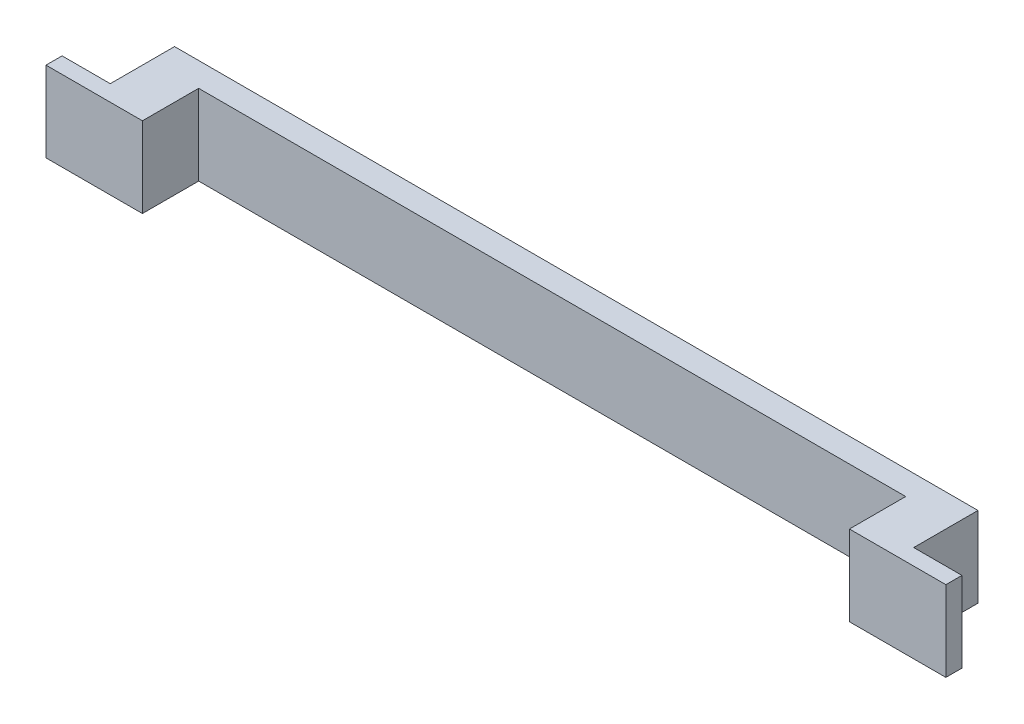
ISO-10303-21;
HEADER;
FILE_DESCRIPTION(('STEP AP214'),'2;1');
FILE_NAME('part.step','',(''),(''),'','','');
FILE_SCHEMA(('AUTOMOTIVE_DESIGN { 1 0 10303 214 1 1 1 1 }'));
ENDSEC;
DATA;
#1=APPLICATION_CONTEXT('core data for automotive mechanical design processes');
#2=APPLICATION_PROTOCOL_DEFINITION('international standard','automotive_design',2000,#1);
#3=PRODUCT_CONTEXT('',#1,'mechanical');
#4=PRODUCT('Part','Part','',(#3));
#5=PRODUCT_RELATED_PRODUCT_CATEGORY('part','',(#4));
#6=PRODUCT_DEFINITION_FORMATION('','',#4);
#7=PRODUCT_DEFINITION_CONTEXT('part definition',#1,'design');
#8=PRODUCT_DEFINITION('design','',#6,#7);
#9=PRODUCT_DEFINITION_SHAPE('','',#8);
#10=(LENGTH_UNIT() NAMED_UNIT(*) SI_UNIT(.MILLI.,.METRE.));
#11=(NAMED_UNIT(*) PLANE_ANGLE_UNIT() SI_UNIT($,.RADIAN.));
#12=(NAMED_UNIT(*) SI_UNIT($,.STERADIAN.) SOLID_ANGLE_UNIT());
#13=UNCERTAINTY_MEASURE_WITH_UNIT(LENGTH_MEASURE(1.E-05),#10,'distance_accuracy_value','');
#14=(GEOMETRIC_REPRESENTATION_CONTEXT(3) GLOBAL_UNCERTAINTY_ASSIGNED_CONTEXT((#13)) GLOBAL_UNIT_ASSIGNED_CONTEXT((#10,
#11,#12)) REPRESENTATION_CONTEXT('',''));
#15=CARTESIAN_POINT('',(0.,0.,0.));
#16=DIRECTION('',(0.,0.,1.));
#17=DIRECTION('',(1.,0.,0.));
#18=AXIS2_PLACEMENT_3D('',#15,#16,#17);
#19=CARTESIAN_POINT('',(25.,5.,0.499999999999989));
#20=DIRECTION('',(-1.,0.,0.));
#21=DIRECTION('',(0.,0.,1.));
#22=AXIS2_PLACEMENT_3D('',#19,#20,#21);
#23=PLANE('',#22);
#24=DIRECTION('',(0.,1.,0.));
#25=VECTOR('',#24,1.);
#26=CARTESIAN_POINT('',(25.,5.,3.5));
#27=LINE('',#26,#25);
#28=CARTESIAN_POINT('',(25.,0.,3.5));
#29=VERTEX_POINT('',#28);
#30=CARTESIAN_POINT('',(25.,5.,3.5));
#31=VERTEX_POINT('',#30);
#32=EDGE_CURVE('E52',#29,#31,#27,.T.);
#33=ORIENTED_EDGE('',*,*,#32,.F.);
#34=DIRECTION('',(0.,0.,-1.));
#35=VECTOR('',#34,1.);
#36=CARTESIAN_POINT('',(25.,0.,0.499999999999989));
#37=LINE('',#36,#35);
#38=CARTESIAN_POINT('',(25.,0.,-0.499999999999995));
#39=VERTEX_POINT('',#38);
#40=EDGE_CURVE('E143',#29,#39,#37,.T.);
#41=ORIENTED_EDGE('',*,*,#40,.T.);
#42=DIRECTION('',(0.,-1.,0.));
#43=VECTOR('',#42,1.);
#44=CARTESIAN_POINT('',(25.,5.,-0.499999999999995));
#45=LINE('',#44,#43);
#46=CARTESIAN_POINT('',(25.,5.,-0.499999999999995));
#47=VERTEX_POINT('',#46);
#48=EDGE_CURVE('E11',#47,#39,#45,.T.);
#49=ORIENTED_EDGE('',*,*,#48,.F.);
#50=DIRECTION('',(0.,0.,-1.));
#51=VECTOR('',#50,1.);
#52=CARTESIAN_POINT('',(25.,5.,0.499999999999989));
#53=LINE('',#52,#51);
#54=EDGE_CURVE('E48',#31,#47,#53,.T.);
#55=ORIENTED_EDGE('',*,*,#54,.F.);
#56=EDGE_LOOP('',(#33,#41,#49,#55));
#57=FACE_BOUND('',#56,.T.);
#58=ADVANCED_FACE('F33',(#57),#23,.F.);
#59=CARTESIAN_POINT('',(-25.,5.,0.499999999999995));
#60=DIRECTION('',(1.,0.,0.));
#61=DIRECTION('',(0.,0.,-1.));
#62=AXIS2_PLACEMENT_3D('',#59,#60,#61);
#63=PLANE('',#62);
#64=DIRECTION('',(0.,-1.,0.));
#65=VECTOR('',#64,1.);
#66=CARTESIAN_POINT('',(-25.,5.,3.5));
#67=LINE('',#66,#65);
#68=CARTESIAN_POINT('',(-25.,5.,3.5));
#69=VERTEX_POINT('',#68);
#70=CARTESIAN_POINT('',(-25.,0.,3.5));
#71=VERTEX_POINT('',#70);
#72=EDGE_CURVE('E165',#69,#71,#67,.T.);
#73=ORIENTED_EDGE('',*,*,#72,.F.);
#74=DIRECTION('',(0.,0.,1.));
#75=VECTOR('',#74,1.);
#76=CARTESIAN_POINT('',(-25.,5.,0.499999999999995));
#77=LINE('',#76,#75);
#78=CARTESIAN_POINT('',(-25.,5.,-0.500000000000005));
#79=VERTEX_POINT('',#78);
#80=EDGE_CURVE('E173',#79,#69,#77,.T.);
#81=ORIENTED_EDGE('',*,*,#80,.F.);
#82=DIRECTION('',(0.,-1.,0.));
#83=VECTOR('',#82,1.);
#84=CARTESIAN_POINT('',(-25.,5.,-0.500000000000005));
#85=LINE('',#84,#83);
#86=CARTESIAN_POINT('',(-25.,0.,-0.500000000000005));
#87=VERTEX_POINT('',#86);
#88=EDGE_CURVE('E41',#79,#87,#85,.T.);
#89=ORIENTED_EDGE('',*,*,#88,.T.);
#90=DIRECTION('',(0.,0.,1.));
#91=VECTOR('',#90,1.);
#92=CARTESIAN_POINT('',(-25.,0.,0.499999999999995));
#93=LINE('',#92,#91);
#94=EDGE_CURVE('E189',#87,#71,#93,.T.);
#95=ORIENTED_EDGE('',*,*,#94,.T.);
#96=EDGE_LOOP('',(#73,#81,#89,#95));
#97=FACE_BOUND('',#96,.T.);
#98=ADVANCED_FACE('F218',(#97),#63,.F.);
#99=CARTESIAN_POINT('',(-25.,5.,-0.500000000000005));
#100=DIRECTION('',(0.,0.,1.));
#101=DIRECTION('',(1.,0.,0.));
#102=AXIS2_PLACEMENT_3D('',#99,#100,#101);
#103=PLANE('',#102);
#104=DIRECTION('',(-1.,0.,0.));
#105=VECTOR('',#104,1.);
#106=CARTESIAN_POINT('',(-25.,0.,-0.500000000000005));
#107=LINE('',#106,#105);
#108=EDGE_CURVE('E169',#39,#87,#107,.T.);
#109=ORIENTED_EDGE('',*,*,#108,.T.);
#110=ORIENTED_EDGE('',*,*,#88,.F.);
#111=DIRECTION('',(-1.,0.,0.));
#112=VECTOR('',#111,1.);
#113=CARTESIAN_POINT('',(-25.,5.,-0.500000000000005));
#114=LINE('',#113,#112);
#115=EDGE_CURVE('E171',#47,#79,#114,.T.);
#116=ORIENTED_EDGE('',*,*,#115,.F.);
#117=ORIENTED_EDGE('',*,*,#48,.T.);
#118=EDGE_LOOP('',(#109,#110,#116,#117));
#119=FACE_BOUND('',#118,.T.);
#120=ADVANCED_FACE('F35',(#119),#103,.F.);
#121=CARTESIAN_POINT('',(-25.,5.,4.5));
#122=DIRECTION('',(0.,0.,-1.));
#123=DIRECTION('',(-1.,0.,0.));
#124=AXIS2_PLACEMENT_3D('',#121,#122,#123);
#125=PLANE('',#124);
#126=DIRECTION('',(1.,0.,0.));
#127=VECTOR('',#126,1.);
#128=CARTESIAN_POINT('',(-25.,0.,4.5));
#129=LINE('',#128,#127);
#130=CARTESIAN_POINT('',(-28.,0.,4.5));
#131=VERTEX_POINT('',#130);
#132=CARTESIAN_POINT('',(-22.,0.,4.5));
#133=VERTEX_POINT('',#132);
#134=EDGE_CURVE('E192',#131,#133,#129,.T.);
#135=ORIENTED_EDGE('',*,*,#134,.T.);
#136=DIRECTION('',(0.,-1.,0.));
#137=VECTOR('',#136,1.);
#138=CARTESIAN_POINT('',(-22.,5.,4.5));
#139=LINE('',#138,#137);
#140=CARTESIAN_POINT('',(-22.,5.,4.5));
#141=VERTEX_POINT('',#140);
#142=EDGE_CURVE('E211',#141,#133,#139,.T.);
#143=ORIENTED_EDGE('',*,*,#142,.F.);
#144=DIRECTION('',(1.,0.,0.));
#145=VECTOR('',#144,1.);
#146=CARTESIAN_POINT('',(-25.,5.,4.5));
#147=LINE('',#146,#145);
#148=CARTESIAN_POINT('',(-28.,5.,4.5));
#149=VERTEX_POINT('',#148);
#150=EDGE_CURVE('E176',#149,#141,#147,.T.);
#151=ORIENTED_EDGE('',*,*,#150,.F.);
#152=DIRECTION('',(0.,-1.,0.));
#153=VECTOR('',#152,1.);
#154=CARTESIAN_POINT('',(-28.,0.,4.5));
#155=LINE('',#154,#153);
#156=EDGE_CURVE('E150',#149,#131,#155,.T.);
#157=ORIENTED_EDGE('',*,*,#156,.T.);
#158=EDGE_LOOP('',(#135,#143,#151,#157));
#159=FACE_BOUND('',#158,.T.);
#160=ADVANCED_FACE('F251',(#159),#125,.F.);
#161=CARTESIAN_POINT('',(-22.,5.,0.999999999999995));
#162=DIRECTION('',(-1.,0.,0.));
#163=DIRECTION('',(0.,0.,1.));
#164=AXIS2_PLACEMENT_3D('',#161,#162,#163);
#165=PLANE('',#164);
#166=DIRECTION('',(0.,0.,-1.));
#167=VECTOR('',#166,1.);
#168=CARTESIAN_POINT('',(-22.,0.,0.999999999999995));
#169=LINE('',#168,#167);
#170=CARTESIAN_POINT('',(-22.,0.,0.999999999999995));
#171=VERTEX_POINT('',#170);
#172=EDGE_CURVE('E194',#133,#171,#169,.T.);
#173=ORIENTED_EDGE('',*,*,#172,.T.);
#174=DIRECTION('',(0.,-1.,0.));
#175=VECTOR('',#174,1.);
#176=CARTESIAN_POINT('',(-22.,5.,0.999999999999995));
#177=LINE('',#176,#175);
#178=CARTESIAN_POINT('',(-22.,5.,0.999999999999995));
#179=VERTEX_POINT('',#178);
#180=EDGE_CURVE('E208',#179,#171,#177,.T.);
#181=ORIENTED_EDGE('',*,*,#180,.F.);
#182=DIRECTION('',(0.,0.,-1.));
#183=VECTOR('',#182,1.);
#184=CARTESIAN_POINT('',(-22.,5.,0.999999999999995));
#185=LINE('',#184,#183);
#186=EDGE_CURVE('E178',#141,#179,#185,.T.);
#187=ORIENTED_EDGE('',*,*,#186,.F.);
#188=ORIENTED_EDGE('',*,*,#142,.T.);
#189=EDGE_LOOP('',(#173,#181,#187,#188));
#190=FACE_BOUND('',#189,.T.);
#191=ADVANCED_FACE('F245',(#190),#165,.F.);
#192=CARTESIAN_POINT('',(-22.,5.,0.999999999999995));
#193=DIRECTION('',(0.,0.,-1.));
#194=DIRECTION('',(-1.,0.,0.));
#195=AXIS2_PLACEMENT_3D('',#192,#193,#194);
#196=PLANE('',#195);
#197=DIRECTION('',(1.,0.,0.));
#198=VECTOR('',#197,1.);
#199=CARTESIAN_POINT('',(-22.,0.,0.999999999999995));
#200=LINE('',#199,#198);
#201=CARTESIAN_POINT('',(22.,0.,0.999999999999989));
#202=VERTEX_POINT('',#201);
#203=EDGE_CURVE('E196',#171,#202,#200,.T.);
#204=ORIENTED_EDGE('',*,*,#203,.T.);
#205=DIRECTION('',(0.,-1.,0.));
#206=VECTOR('',#205,1.);
#207=CARTESIAN_POINT('',(22.,5.,0.999999999999989));
#208=LINE('',#207,#206);
#209=CARTESIAN_POINT('',(22.,5.,0.999999999999989));
#210=VERTEX_POINT('',#209);
#211=EDGE_CURVE('E205',#210,#202,#208,.T.);
#212=ORIENTED_EDGE('',*,*,#211,.F.);
#213=DIRECTION('',(1.,0.,0.));
#214=VECTOR('',#213,1.);
#215=CARTESIAN_POINT('',(-22.,5.,0.999999999999995));
#216=LINE('',#215,#214);
#217=EDGE_CURVE('E180',#179,#210,#216,.T.);
#218=ORIENTED_EDGE('',*,*,#217,.F.);
#219=ORIENTED_EDGE('',*,*,#180,.T.);
#220=EDGE_LOOP('',(#204,#212,#218,#219));
#221=FACE_BOUND('',#220,.T.);
#222=ADVANCED_FACE('F241',(#221),#196,.F.);
#223=CARTESIAN_POINT('',(22.,5.,0.999999999999989));
#224=DIRECTION('',(1.,0.,0.));
#225=DIRECTION('',(0.,0.,-1.));
#226=AXIS2_PLACEMENT_3D('',#223,#224,#225);
#227=PLANE('',#226);
#228=DIRECTION('',(0.,-1.,0.));
#229=VECTOR('',#228,1.);
#230=CARTESIAN_POINT('',(22.,5.,4.49999999999999));
#231=LINE('',#230,#229);
#232=CARTESIAN_POINT('',(22.,5.,4.49999999999999));
#233=VERTEX_POINT('',#232);
#234=CARTESIAN_POINT('',(22.,0.,4.49999999999999));
#235=VERTEX_POINT('',#234);
#236=EDGE_CURVE('E186',#233,#235,#231,.T.);
#237=ORIENTED_EDGE('',*,*,#236,.F.);
#238=DIRECTION('',(0.,0.,1.));
#239=VECTOR('',#238,1.);
#240=CARTESIAN_POINT('',(22.,5.,0.999999999999989));
#241=LINE('',#240,#239);
#242=EDGE_CURVE('E182',#210,#233,#241,.T.);
#243=ORIENTED_EDGE('',*,*,#242,.F.);
#244=ORIENTED_EDGE('',*,*,#211,.T.);
#245=DIRECTION('',(0.,0.,1.));
#246=VECTOR('',#245,1.);
#247=CARTESIAN_POINT('',(22.,0.,0.999999999999989));
#248=LINE('',#247,#246);
#249=EDGE_CURVE('E198',#202,#235,#248,.T.);
#250=ORIENTED_EDGE('',*,*,#249,.T.);
#251=EDGE_LOOP('',(#237,#243,#244,#250));
#252=FACE_BOUND('',#251,.T.);
#253=ADVANCED_FACE('F236',(#252),#227,.F.);
#254=CARTESIAN_POINT('',(25.,5.,4.49999999999999));
#255=DIRECTION('',(0.,0.,-1.));
#256=DIRECTION('',(-1.,0.,0.));
#257=AXIS2_PLACEMENT_3D('',#254,#255,#256);
#258=PLANE('',#257);
#259=DIRECTION('',(1.,0.,0.));
#260=VECTOR('',#259,1.);
#261=CARTESIAN_POINT('',(25.,0.,4.49999999999999));
#262=LINE('',#261,#260);
#263=CARTESIAN_POINT('',(28.,0.,4.5));
#264=VERTEX_POINT('',#263);
#265=EDGE_CURVE('E200',#235,#264,#262,.T.);
#266=ORIENTED_EDGE('',*,*,#265,.T.);
#267=DIRECTION('',(0.,-1.,0.));
#268=VECTOR('',#267,1.);
#269=CARTESIAN_POINT('',(28.,0.,4.5));
#270=LINE('',#269,#268);
#271=CARTESIAN_POINT('',(28.,5.,4.5));
#272=VERTEX_POINT('',#271);
#273=EDGE_CURVE('E136',#272,#264,#270,.T.);
#274=ORIENTED_EDGE('',*,*,#273,.F.);
#275=DIRECTION('',(1.,0.,0.));
#276=VECTOR('',#275,1.);
#277=CARTESIAN_POINT('',(25.,5.,4.49999999999999));
#278=LINE('',#277,#276);
#279=EDGE_CURVE('E184',#233,#272,#278,.T.);
#280=ORIENTED_EDGE('',*,*,#279,.F.);
#281=ORIENTED_EDGE('',*,*,#236,.T.);
#282=EDGE_LOOP('',(#266,#274,#280,#281));
#283=FACE_BOUND('',#282,.T.);
#284=ADVANCED_FACE('F230',(#283),#258,.F.);
#285=CARTESIAN_POINT('',(0.,5.,0.));
#286=DIRECTION('',(0.,-1.,0.));
#287=DIRECTION('',(0.,0.,-1.));
#288=AXIS2_PLACEMENT_3D('',#285,#286,#287);
#289=PLANE('',#288);
#290=ORIENTED_EDGE('',*,*,#279,.T.);
#291=DIRECTION('',(0.,0.,1.));
#292=VECTOR('',#291,1.);
#293=CARTESIAN_POINT('',(28.,5.,3.5));
#294=LINE('',#293,#292);
#295=CARTESIAN_POINT('',(28.,5.,3.5));
#296=VERTEX_POINT('',#295);
#297=EDGE_CURVE('E139',#296,#272,#294,.T.);
#298=ORIENTED_EDGE('',*,*,#297,.F.);
#299=DIRECTION('',(1.,0.,0.));
#300=VECTOR('',#299,1.);
#301=CARTESIAN_POINT('',(22.,5.,3.5));
#302=LINE('',#301,#300);
#303=EDGE_CURVE('E126',#31,#296,#302,.T.);
#304=ORIENTED_EDGE('',*,*,#303,.F.);
#305=ORIENTED_EDGE('',*,*,#54,.T.);
#306=ORIENTED_EDGE('',*,*,#115,.T.);
#307=ORIENTED_EDGE('',*,*,#80,.T.);
#308=DIRECTION('',(-1.,0.,0.));
#309=VECTOR('',#308,1.);
#310=CARTESIAN_POINT('',(-22.,5.,3.5));
#311=LINE('',#310,#309);
#312=CARTESIAN_POINT('',(-28.,5.,3.5));
#313=VERTEX_POINT('',#312);
#314=EDGE_CURVE('E151',#69,#313,#311,.T.);
#315=ORIENTED_EDGE('',*,*,#314,.T.);
#316=DIRECTION('',(0.,0.,1.));
#317=VECTOR('',#316,1.);
#318=CARTESIAN_POINT('',(-28.,5.,3.5));
#319=LINE('',#318,#317);
#320=EDGE_CURVE('E159',#313,#149,#319,.T.);
#321=ORIENTED_EDGE('',*,*,#320,.T.);
#322=ORIENTED_EDGE('',*,*,#150,.T.);
#323=ORIENTED_EDGE('',*,*,#186,.T.);
#324=ORIENTED_EDGE('',*,*,#217,.T.);
#325=ORIENTED_EDGE('',*,*,#242,.T.);
#326=EDGE_LOOP('',(#290,#298,#304,#305,#306,#307,#315,#321,#322,#323,#324,#325));
#327=FACE_BOUND('',#326,.T.);
#328=ADVANCED_FACE('F226',(#327),#289,.F.);
#329=CARTESIAN_POINT('',(0.,0.,0.));
#330=DIRECTION('',(0.,-1.,0.));
#331=DIRECTION('',(0.,0.,-1.));
#332=AXIS2_PLACEMENT_3D('',#329,#330,#331);
#333=PLANE('',#332);
#334=ORIENTED_EDGE('',*,*,#265,.F.);
#335=ORIENTED_EDGE('',*,*,#249,.F.);
#336=ORIENTED_EDGE('',*,*,#203,.F.);
#337=ORIENTED_EDGE('',*,*,#172,.F.);
#338=ORIENTED_EDGE('',*,*,#134,.F.);
#339=DIRECTION('',(0.,0.,1.));
#340=VECTOR('',#339,1.);
#341=CARTESIAN_POINT('',(-28.,0.,3.5));
#342=LINE('',#341,#340);
#343=CARTESIAN_POINT('',(-28.,0.,3.5));
#344=VERTEX_POINT('',#343);
#345=EDGE_CURVE('E162',#344,#131,#342,.T.);
#346=ORIENTED_EDGE('',*,*,#345,.F.);
#347=DIRECTION('',(1.,0.,0.));
#348=VECTOR('',#347,1.);
#349=CARTESIAN_POINT('',(-22.,0.,3.5));
#350=LINE('',#349,#348);
#351=EDGE_CURVE('E156',#344,#71,#350,.T.);
#352=ORIENTED_EDGE('',*,*,#351,.T.);
#353=ORIENTED_EDGE('',*,*,#94,.F.);
#354=ORIENTED_EDGE('',*,*,#108,.F.);
#355=ORIENTED_EDGE('',*,*,#40,.F.);
#356=DIRECTION('',(-1.,0.,0.));
#357=VECTOR('',#356,1.);
#358=CARTESIAN_POINT('',(22.,0.,3.5));
#359=LINE('',#358,#357);
#360=CARTESIAN_POINT('',(28.,0.,3.5));
#361=VERTEX_POINT('',#360);
#362=EDGE_CURVE('E124',#361,#29,#359,.T.);
#363=ORIENTED_EDGE('',*,*,#362,.F.);
#364=DIRECTION('',(0.,0.,1.));
#365=VECTOR('',#364,1.);
#366=CARTESIAN_POINT('',(28.,0.,3.5));
#367=LINE('',#366,#365);
#368=EDGE_CURVE('E133',#361,#264,#367,.T.);
#369=ORIENTED_EDGE('',*,*,#368,.T.);
#370=EDGE_LOOP('',(#334,#335,#336,#337,#338,#346,#352,#353,#354,#355,#363,#369));
#371=FACE_BOUND('',#370,.T.);
#372=ADVANCED_FACE('F141',(#371),#333,.T.);
#373=CARTESIAN_POINT('',(0.,0.,3.5));
#374=DIRECTION('',(0.,0.,1.));
#375=DIRECTION('',(1.,0.,0.));
#376=AXIS2_PLACEMENT_3D('',#373,#374,#375);
#377=PLANE('',#376);
#378=ORIENTED_EDGE('',*,*,#314,.F.);
#379=ORIENTED_EDGE('',*,*,#72,.T.);
#380=ORIENTED_EDGE('',*,*,#351,.F.);
#381=DIRECTION('',(0.,-1.,0.));
#382=VECTOR('',#381,1.);
#383=CARTESIAN_POINT('',(-28.,0.,3.5));
#384=LINE('',#383,#382);
#385=EDGE_CURVE('E153',#313,#344,#384,.T.);
#386=ORIENTED_EDGE('',*,*,#385,.F.);
#387=EDGE_LOOP('',(#378,#379,#380,#386));
#388=FACE_BOUND('',#387,.T.);
#389=ADVANCED_FACE('F224',(#388),#377,.F.);
#390=CARTESIAN_POINT('',(-28.,0.,3.5));
#391=DIRECTION('',(-1.,0.,0.));
#392=DIRECTION('',(0.,0.,1.));
#393=AXIS2_PLACEMENT_3D('',#390,#391,#392);
#394=PLANE('',#393);
#395=ORIENTED_EDGE('',*,*,#156,.F.);
#396=ORIENTED_EDGE('',*,*,#320,.F.);
#397=ORIENTED_EDGE('',*,*,#385,.T.);
#398=ORIENTED_EDGE('',*,*,#345,.T.);
#399=EDGE_LOOP('',(#395,#396,#397,#398));
#400=FACE_BOUND('',#399,.T.);
#401=ADVANCED_FACE('F250',(#400),#394,.T.);
#402=CARTESIAN_POINT('',(0.,0.,3.5));
#403=DIRECTION('',(0.,0.,1.));
#404=DIRECTION('',(-1.,0.,0.));
#405=AXIS2_PLACEMENT_3D('',#402,#403,#404);
#406=PLANE('',#405);
#407=ORIENTED_EDGE('',*,*,#362,.T.);
#408=ORIENTED_EDGE('',*,*,#32,.T.);
#409=ORIENTED_EDGE('',*,*,#303,.T.);
#410=DIRECTION('',(0.,-1.,0.));
#411=VECTOR('',#410,1.);
#412=CARTESIAN_POINT('',(28.,0.,3.5));
#413=LINE('',#412,#411);
#414=EDGE_CURVE('E120',#296,#361,#413,.T.);
#415=ORIENTED_EDGE('',*,*,#414,.T.);
#416=EDGE_LOOP('',(#407,#408,#409,#415));
#417=FACE_BOUND('',#416,.T.);
#418=ADVANCED_FACE('F122',(#417),#406,.F.);
#419=CARTESIAN_POINT('',(28.,0.,3.5));
#420=DIRECTION('',(-1.,0.,0.));
#421=DIRECTION('',(0.,0.,1.));
#422=AXIS2_PLACEMENT_3D('',#419,#420,#421);
#423=PLANE('',#422);
#424=ORIENTED_EDGE('',*,*,#273,.T.);
#425=ORIENTED_EDGE('',*,*,#368,.F.);
#426=ORIENTED_EDGE('',*,*,#414,.F.);
#427=ORIENTED_EDGE('',*,*,#297,.T.);
#428=EDGE_LOOP('',(#424,#425,#426,#427));
#429=FACE_BOUND('',#428,.T.);
#430=ADVANCED_FACE('F134',(#429),#423,.F.);
#431=CLOSED_SHELL('',(#58,#98,#120,#160,#191,#222,#253,#284,#328,#372,#389,#401,#418,#430));
#432=MANIFOLD_SOLID_BREP('B2',#431);
#433=ADVANCED_BREP_SHAPE_REPRESENTATION('',(#18,#432),#14);
#434=SHAPE_DEFINITION_REPRESENTATION(#9,#433);
ENDSEC;
END-ISO-10303-21;
